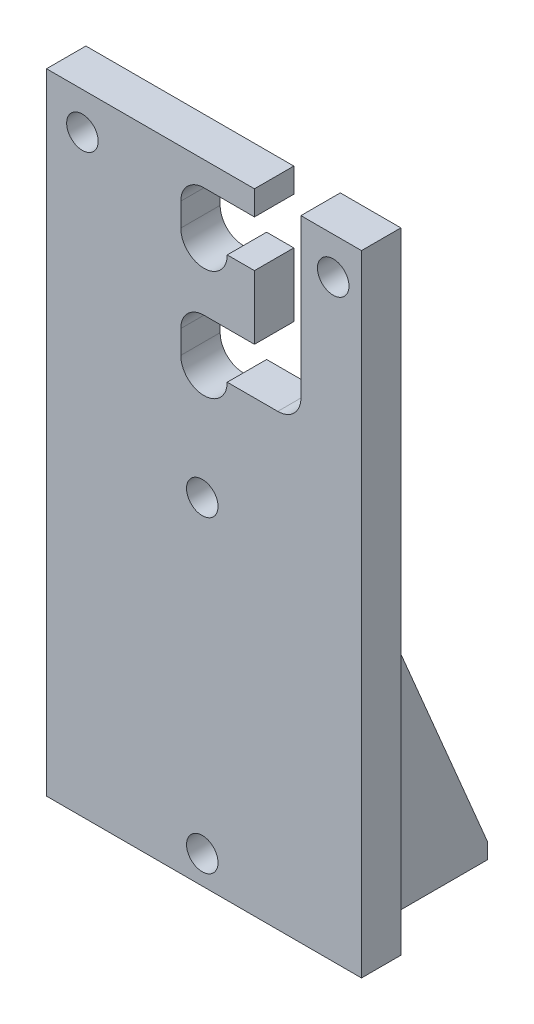
ISO-10303-21;
HEADER;
FILE_DESCRIPTION(('STEP AP214'),'2;1');
FILE_NAME('part.step','',(''),(''),'','','');
FILE_SCHEMA(('AUTOMOTIVE_DESIGN { 1 0 10303 214 1 1 1 1 }'));
ENDSEC;
DATA;
#1=APPLICATION_CONTEXT('core data for automotive mechanical design processes');
#2=APPLICATION_PROTOCOL_DEFINITION('international standard','automotive_design',2000,#1);
#3=PRODUCT_CONTEXT('',#1,'mechanical');
#4=PRODUCT('Part','Part','',(#3));
#5=PRODUCT_RELATED_PRODUCT_CATEGORY('part','',(#4));
#6=PRODUCT_DEFINITION_FORMATION('','',#4);
#7=PRODUCT_DEFINITION_CONTEXT('part definition',#1,'design');
#8=PRODUCT_DEFINITION('design','',#6,#7);
#9=PRODUCT_DEFINITION_SHAPE('','',#8);
#10=(LENGTH_UNIT() NAMED_UNIT(*) SI_UNIT(.MILLI.,.METRE.));
#11=(NAMED_UNIT(*) PLANE_ANGLE_UNIT() SI_UNIT($,.RADIAN.));
#12=(NAMED_UNIT(*) SI_UNIT($,.STERADIAN.) SOLID_ANGLE_UNIT());
#13=UNCERTAINTY_MEASURE_WITH_UNIT(LENGTH_MEASURE(1.E-05),#10,'distance_accuracy_value','');
#14=(GEOMETRIC_REPRESENTATION_CONTEXT(3) GLOBAL_UNCERTAINTY_ASSIGNED_CONTEXT((#13)) GLOBAL_UNIT_ASSIGNED_CONTEXT((#10,
#11,#12)) REPRESENTATION_CONTEXT('',''));
#15=CARTESIAN_POINT('',(0.,0.,0.));
#16=DIRECTION('',(0.,0.,1.));
#17=DIRECTION('',(1.,0.,0.));
#18=AXIS2_PLACEMENT_3D('',#15,#16,#17);
#19=CARTESIAN_POINT('',(0.,0.,2.5));
#20=DIRECTION('',(0.,0.,1.));
#21=DIRECTION('',(1.,0.,0.));
#22=AXIS2_PLACEMENT_3D('',#19,#20,#21);
#23=PLANE('',#22);
#24=CARTESIAN_POINT('',(2.27941903587919,37.6474717963443,2.5));
#25=DIRECTION('',(0.,0.,1.));
#26=DIRECTION('',(1.,0.,0.));
#27=AXIS2_PLACEMENT_3D('',#24,#25,#26);
#28=CIRCLE('',#27,1.);
#29=CARTESIAN_POINT('',(3.27941903587919,37.6474717963443,2.5));
#30=VERTEX_POINT('',#29);
#31=EDGE_CURVE('E240',#30,#30,#28,.T.);
#32=ORIENTED_EDGE('',*,*,#31,.F.);
#33=EDGE_LOOP('',(#32));
#34=FACE_BOUND('',#33,.T.);
#35=CARTESIAN_POINT('',(18.2044218174552,37.6474717963443,2.5));
#36=DIRECTION('',(0.,0.,1.));
#37=DIRECTION('',(1.,0.,0.));
#38=AXIS2_PLACEMENT_3D('',#35,#36,#37);
#39=CIRCLE('',#38,1.);
#40=CARTESIAN_POINT('',(19.2044218174552,37.6474717963443,2.5));
#41=VERTEX_POINT('',#40);
#42=EDGE_CURVE('E260',#41,#41,#39,.T.);
#43=ORIENTED_EDGE('',*,*,#42,.F.);
#44=EDGE_LOOP('',(#43));
#45=FACE_BOUND('',#44,.T.);
#46=CARTESIAN_POINT('',(9.89082515276729,1.78639023600702,2.5));
#47=DIRECTION('',(0.,0.,1.));
#48=DIRECTION('',(1.,0.,0.));
#49=AXIS2_PLACEMENT_3D('',#46,#47,#48);
#50=CIRCLE('',#49,1.);
#51=CARTESIAN_POINT('',(10.8908251527673,1.78639023600702,2.5));
#52=VERTEX_POINT('',#51);
#53=EDGE_CURVE('E257',#52,#52,#50,.T.);
#54=ORIENTED_EDGE('',*,*,#53,.F.);
#55=EDGE_LOOP('',(#54));
#56=FACE_BOUND('',#55,.T.);
#57=CARTESIAN_POINT('',(9.89082515276729,21.3671843236039,2.5));
#58=DIRECTION('',(0.,0.,1.));
#59=DIRECTION('',(1.,0.,0.));
#60=AXIS2_PLACEMENT_3D('',#57,#58,#59);
#61=CIRCLE('',#60,1.);
#62=CARTESIAN_POINT('',(10.8908251527673,21.3671843236039,2.5));
#63=VERTEX_POINT('',#62);
#64=EDGE_CURVE('E254',#63,#63,#61,.T.);
#65=ORIENTED_EDGE('',*,*,#64,.F.);
#66=EDGE_LOOP('',(#65));
#67=FACE_BOUND('',#66,.T.);
#68=CARTESIAN_POINT('',(10.,35.5,2.5));
#69=DIRECTION('',(0.,0.,-1.));
#70=DIRECTION('',(-1.,0.,0.));
#71=AXIS2_PLACEMENT_3D('',#68,#69,#70);
#72=CIRCLE('',#71,1.475);
#73=CARTESIAN_POINT('',(11.475,35.5,2.5));
#74=VERTEX_POINT('',#73);
#75=CARTESIAN_POINT('',(8.525,35.5,2.5));
#76=VERTEX_POINT('',#75);
#77=EDGE_CURVE('E226',#74,#76,#72,.T.);
#78=ORIENTED_EDGE('',*,*,#77,.T.);
#79=DIRECTION('',(0.,1.,0.));
#80=VECTOR('',#79,1.);
#81=CARTESIAN_POINT('',(8.525,35.5,2.5));
#82=LINE('',#81,#80);
#83=CARTESIAN_POINT('',(8.525,36.98,2.5));
#84=VERTEX_POINT('',#83);
#85=EDGE_CURVE('E386',#76,#84,#82,.T.);
#86=ORIENTED_EDGE('',*,*,#85,.T.);
#87=CARTESIAN_POINT('',(9.995,36.98,2.5));
#88=DIRECTION('',(0.,0.,1.));
#89=DIRECTION('',(1.,0.,0.));
#90=AXIS2_PLACEMENT_3D('',#87,#88,#89);
#91=CIRCLE('',#90,1.47);
#92=CARTESIAN_POINT('',(9.995,38.45,2.5));
#93=VERTEX_POINT('',#92);
#94=EDGE_CURVE('E346',#84,#93,#91,.F.);
#95=ORIENTED_EDGE('',*,*,#94,.T.);
#96=DIRECTION('',(1.,0.,0.));
#97=VECTOR('',#96,1.);
#98=CARTESIAN_POINT('',(9.995,38.45,2.5));
#99=LINE('',#98,#97);
#100=CARTESIAN_POINT('',(13.2029216991025,38.45,2.5));
#101=VERTEX_POINT('',#100);
#102=EDGE_CURVE('E349',#93,#101,#99,.T.);
#103=ORIENTED_EDGE('',*,*,#102,.T.);
#104=DIRECTION('',(0.,1.,0.));
#105=VECTOR('',#104,1.);
#106=CARTESIAN_POINT('',(13.2029216991025,38.45,2.5));
#107=LINE('',#106,#105);
#108=CARTESIAN_POINT('',(13.2029216991025,40.,2.5));
#109=VERTEX_POINT('',#108);
#110=EDGE_CURVE('E65',#101,#109,#107,.T.);
#111=ORIENTED_EDGE('',*,*,#110,.T.);
#112=DIRECTION('',(-1.,0.,0.));
#113=VECTOR('',#112,1.);
#114=CARTESIAN_POINT('',(12.8029216991025,40.,2.5));
#115=LINE('',#114,#113);
#116=CARTESIAN_POINT('',(0.,40.,2.5));
#117=VERTEX_POINT('',#116);
#118=EDGE_CURVE('E11',#109,#117,#115,.T.);
#119=ORIENTED_EDGE('',*,*,#118,.T.);
#120=DIRECTION('',(0.,-1.,0.));
#121=VECTOR('',#120,1.);
#122=CARTESIAN_POINT('',(0.,0.,2.5));
#123=LINE('',#122,#121);
#124=CARTESIAN_POINT('',(0.,0.,2.5));
#125=VERTEX_POINT('',#124);
#126=EDGE_CURVE('E242',#117,#125,#123,.T.);
#127=ORIENTED_EDGE('',*,*,#126,.T.);
#128=DIRECTION('',(1.,0.,0.));
#129=VECTOR('',#128,1.);
#130=CARTESIAN_POINT('',(0.,0.,2.5));
#131=LINE('',#130,#129);
#132=CARTESIAN_POINT('',(20.,0.,2.5));
#133=VERTEX_POINT('',#132);
#134=EDGE_CURVE('E239',#125,#133,#131,.T.);
#135=ORIENTED_EDGE('',*,*,#134,.T.);
#136=DIRECTION('',(0.,1.,0.));
#137=VECTOR('',#136,1.);
#138=CARTESIAN_POINT('',(20.,0.,2.5));
#139=LINE('',#138,#137);
#140=CARTESIAN_POINT('',(20.,40.,2.5));
#141=VERTEX_POINT('',#140);
#142=EDGE_CURVE('E229',#133,#141,#139,.T.);
#143=ORIENTED_EDGE('',*,*,#142,.T.);
#144=CARTESIAN_POINT('',(16.1529216991025,40.,2.5));
#145=VERTEX_POINT('',#144);
#146=EDGE_CURVE('E52',#141,#145,#115,.T.);
#147=ORIENTED_EDGE('',*,*,#146,.T.);
#148=DIRECTION('',(0.,1.,0.));
#149=VECTOR('',#148,1.);
#150=CARTESIAN_POINT('',(16.1529216991025,29.97,2.5));
#151=LINE('',#150,#149);
#152=CARTESIAN_POINT('',(16.1529216991025,29.97,2.5));
#153=VERTEX_POINT('',#152);
#154=EDGE_CURVE('E388',#153,#145,#151,.T.);
#155=ORIENTED_EDGE('',*,*,#154,.F.);
#156=CARTESIAN_POINT('',(14.6829216991025,29.97,2.5));
#157=DIRECTION('',(0.,0.,1.));
#158=DIRECTION('',(1.,0.,0.));
#159=AXIS2_PLACEMENT_3D('',#156,#157,#158);
#160=CIRCLE('',#159,1.47);
#161=CARTESIAN_POINT('',(14.6829216991025,28.5,2.5));
#162=VERTEX_POINT('',#161);
#163=EDGE_CURVE('E390',#162,#153,#160,.T.);
#164=ORIENTED_EDGE('',*,*,#163,.F.);
#165=DIRECTION('',(1.,0.,0.));
#166=VECTOR('',#165,1.);
#167=CARTESIAN_POINT('',(11.475,28.5,2.5));
#168=LINE('',#167,#166);
#169=CARTESIAN_POINT('',(11.475,28.5,2.5));
#170=VERTEX_POINT('',#169);
#171=EDGE_CURVE('E394',#170,#162,#168,.T.);
#172=ORIENTED_EDGE('',*,*,#171,.F.);
#173=CARTESIAN_POINT('',(10.,28.5,2.5));
#174=DIRECTION('',(0.,0.,-1.));
#175=DIRECTION('',(-1.,0.,0.));
#176=AXIS2_PLACEMENT_3D('',#173,#174,#175);
#177=CIRCLE('',#176,1.475);
#178=CARTESIAN_POINT('',(8.52499999999949,28.5,2.5));
#179=VERTEX_POINT('',#178);
#180=EDGE_CURVE('E406',#170,#179,#177,.T.);
#181=ORIENTED_EDGE('',*,*,#180,.T.);
#182=DIRECTION('',(3.46944695195255E-13,1.,0.));
#183=VECTOR('',#182,1.);
#184=CARTESIAN_POINT('',(8.525,29.97,2.5));
#185=LINE('',#184,#183);
#186=CARTESIAN_POINT('',(8.525,29.975,2.5));
#187=VERTEX_POINT('',#186);
#188=EDGE_CURVE('E368',#179,#187,#185,.T.);
#189=ORIENTED_EDGE('',*,*,#188,.T.);
#190=CARTESIAN_POINT('',(9.995,29.975,2.5));
#191=DIRECTION('',(0.,0.,1.));
#192=DIRECTION('',(1.,0.,0.));
#193=AXIS2_PLACEMENT_3D('',#190,#191,#192);
#194=CIRCLE('',#193,1.47);
#195=CARTESIAN_POINT('',(9.995,31.445,2.5));
#196=VERTEX_POINT('',#195);
#197=EDGE_CURVE('E369',#187,#196,#194,.F.);
#198=ORIENTED_EDGE('',*,*,#197,.T.);
#199=DIRECTION('',(1.,0.,0.));
#200=VECTOR('',#199,1.);
#201=CARTESIAN_POINT('',(9.995,31.445,2.5));
#202=LINE('',#201,#200);
#203=CARTESIAN_POINT('',(13.2029216991025,31.445,2.5));
#204=VERTEX_POINT('',#203);
#205=EDGE_CURVE('E372',#196,#204,#202,.T.);
#206=ORIENTED_EDGE('',*,*,#205,.T.);
#207=DIRECTION('',(0.,-1.,0.));
#208=VECTOR('',#207,1.);
#209=CARTESIAN_POINT('',(13.2029216991025,35.5,2.5));
#210=LINE('',#209,#208);
#211=CARTESIAN_POINT('',(13.2029216991025,35.5,2.5));
#212=VERTEX_POINT('',#211);
#213=EDGE_CURVE('E397',#212,#204,#210,.T.);
#214=ORIENTED_EDGE('',*,*,#213,.F.);
#215=DIRECTION('',(1.,0.,0.));
#216=VECTOR('',#215,1.);
#217=CARTESIAN_POINT('',(11.475,35.5,2.5));
#218=LINE('',#217,#216);
#219=EDGE_CURVE('E403',#74,#212,#218,.T.);
#220=ORIENTED_EDGE('',*,*,#219,.F.);
#221=EDGE_LOOP('',(#78,#86,#95,#103,#111,#119,#127,#135,#143,#147,#155,#164,#172,#181,#189,#198,
#206,#214,#220));
#222=FACE_BOUND('',#221,.T.);
#223=ADVANCED_FACE('F43',(#34,#45,#56,#67,#222),#23,.T.);
#224=CARTESIAN_POINT('',(5.,1.,-8.));
#225=DIRECTION('',(0.,0.388057000058133,-0.921635375138065));
#226=DIRECTION('',(0.,0.921635375138065,0.388057000058133));
#227=AXIS2_PLACEMENT_3D('',#224,#225,#226);
#228=PLANE('',#227);
#229=DIRECTION('',(0.,0.921635375138065,0.388057000058133));
#230=VECTOR('',#229,1.);
#231=CARTESIAN_POINT('',(2.5,1.,-8.));
#232=LINE('',#231,#230);
#233=CARTESIAN_POINT('',(2.5,1.,-8.));
#234=VERTEX_POINT('',#233);
#235=CARTESIAN_POINT('',(2.5,20.,0.));
#236=VERTEX_POINT('',#235);
#237=EDGE_CURVE('E308',#234,#236,#232,.T.);
#238=ORIENTED_EDGE('',*,*,#237,.T.);
#239=DIRECTION('',(1.,0.,0.));
#240=VECTOR('',#239,1.);
#241=CARTESIAN_POINT('',(0.,20.,0.));
#242=LINE('',#241,#240);
#243=CARTESIAN_POINT('',(7.5,20.,0.));
#244=VERTEX_POINT('',#243);
#245=EDGE_CURVE('E302',#236,#244,#242,.T.);
#246=ORIENTED_EDGE('',*,*,#245,.T.);
#247=DIRECTION('',(0.,0.921635375138065,0.388057000058133));
#248=VECTOR('',#247,1.);
#249=CARTESIAN_POINT('',(7.5,1.,-8.));
#250=LINE('',#249,#248);
#251=CARTESIAN_POINT('',(7.5,1.,-8.));
#252=VERTEX_POINT('',#251);
#253=EDGE_CURVE('E307',#252,#244,#250,.T.);
#254=ORIENTED_EDGE('',*,*,#253,.F.);
#255=DIRECTION('',(1.,0.,0.));
#256=VECTOR('',#255,1.);
#257=CARTESIAN_POINT('',(2.5,1.,-8.));
#258=LINE('',#257,#256);
#259=EDGE_CURVE('E286',#234,#252,#258,.T.);
#260=ORIENTED_EDGE('',*,*,#259,.F.);
#261=EDGE_LOOP('',(#238,#246,#254,#260));
#262=FACE_BOUND('',#261,.T.);
#263=ADVANCED_FACE('F534',(#262),#228,.T.);
#264=CARTESIAN_POINT('',(15.,1.,-8.));
#265=DIRECTION('',(0.,-0.388057000058133,0.921635375138065));
#266=DIRECTION('',(0.,0.921635375138065,0.388057000058133));
#267=AXIS2_PLACEMENT_3D('',#264,#265,#266);
#268=PLANE('',#267);
#269=DIRECTION('',(0.,0.921635375138065,0.388057000058133));
#270=VECTOR('',#269,1.);
#271=CARTESIAN_POINT('',(12.5,1.,-8.));
#272=LINE('',#271,#270);
#273=CARTESIAN_POINT('',(12.5,1.,-8.));
#274=VERTEX_POINT('',#273);
#275=CARTESIAN_POINT('',(12.5,20.,0.));
#276=VERTEX_POINT('',#275);
#277=EDGE_CURVE('E338',#274,#276,#272,.T.);
#278=ORIENTED_EDGE('',*,*,#277,.T.);
#279=DIRECTION('',(-1.,0.,0.));
#280=VECTOR('',#279,1.);
#281=CARTESIAN_POINT('',(0.,20.,0.));
#282=LINE('',#281,#280);
#283=CARTESIAN_POINT('',(17.5,20.,0.));
#284=VERTEX_POINT('',#283);
#285=EDGE_CURVE('E333',#276,#284,#282,.F.);
#286=ORIENTED_EDGE('',*,*,#285,.T.);
#287=DIRECTION('',(0.,0.921635375138065,0.388057000058133));
#288=VECTOR('',#287,1.);
#289=CARTESIAN_POINT('',(17.5,1.,-8.));
#290=LINE('',#289,#288);
#291=CARTESIAN_POINT('',(17.5,1.,-8.));
#292=VERTEX_POINT('',#291);
#293=EDGE_CURVE('E339',#292,#284,#290,.T.);
#294=ORIENTED_EDGE('',*,*,#293,.F.);
#295=DIRECTION('',(-1.,0.,0.));
#296=VECTOR('',#295,1.);
#297=CARTESIAN_POINT('',(17.5,1.,-8.));
#298=LINE('',#297,#296);
#299=EDGE_CURVE('E317',#292,#274,#298,.T.);
#300=ORIENTED_EDGE('',*,*,#299,.T.);
#301=EDGE_LOOP('',(#278,#286,#294,#300));
#302=FACE_BOUND('',#301,.T.);
#303=ADVANCED_FACE('F536',(#302),#268,.F.);
#304=CARTESIAN_POINT('',(8.525,35.5,17.551106751586));
#305=DIRECTION('',(-1.,0.,0.));
#306=DIRECTION('',(0.,0.,1.));
#307=AXIS2_PLACEMENT_3D('',#304,#305,#306);
#308=PLANE('',#307);
#309=DIRECTION('',(0.,0.,-1.));
#310=VECTOR('',#309,1.);
#311=CARTESIAN_POINT('',(8.525,35.5,17.551106751586));
#312=LINE('',#311,#310);
#313=CARTESIAN_POINT('',(8.525,35.5,0.));
#314=VERTEX_POINT('',#313);
#315=EDGE_CURVE('E381',#76,#314,#312,.T.);
#316=ORIENTED_EDGE('',*,*,#315,.T.);
#317=DIRECTION('',(0.,1.,0.));
#318=VECTOR('',#317,1.);
#319=CARTESIAN_POINT('',(8.525,35.5,0.));
#320=LINE('',#319,#318);
#321=CARTESIAN_POINT('',(8.525,36.98,0.));
#322=VERTEX_POINT('',#321);
#323=EDGE_CURVE('E410',#314,#322,#320,.T.);
#324=ORIENTED_EDGE('',*,*,#323,.T.);
#325=DIRECTION('',(0.,0.,-1.));
#326=VECTOR('',#325,1.);
#327=CARTESIAN_POINT('',(8.525,36.98,17.551106751586));
#328=LINE('',#327,#326);
#329=EDGE_CURVE('E384',#84,#322,#328,.T.);
#330=ORIENTED_EDGE('',*,*,#329,.F.);
#331=ORIENTED_EDGE('',*,*,#85,.F.);
#332=EDGE_LOOP('',(#316,#324,#330,#331));
#333=FACE_BOUND('',#332,.T.);
#334=ADVANCED_FACE('F479',(#333),#308,.F.);
#335=CARTESIAN_POINT('',(9.995,36.98,17.551106751586));
#336=DIRECTION('',(0.,0.,-1.));
#337=DIRECTION('',(-1.,0.,0.));
#338=AXIS2_PLACEMENT_3D('',#335,#336,#337);
#339=CYLINDRICAL_SURFACE('',#338,1.47);
#340=ORIENTED_EDGE('',*,*,#329,.T.);
#341=CARTESIAN_POINT('',(9.995,36.98,0.));
#342=DIRECTION('',(0.,0.,-1.));
#343=DIRECTION('',(-1.,0.,0.));
#344=AXIS2_PLACEMENT_3D('',#341,#342,#343);
#345=CIRCLE('',#344,1.47);
#346=CARTESIAN_POINT('',(9.995,38.45,0.));
#347=VERTEX_POINT('',#346);
#348=EDGE_CURVE('E391',#322,#347,#345,.T.);
#349=ORIENTED_EDGE('',*,*,#348,.T.);
#350=DIRECTION('',(0.,0.,-1.));
#351=VECTOR('',#350,1.);
#352=CARTESIAN_POINT('',(9.995,38.45,17.551106751586));
#353=LINE('',#352,#351);
#354=EDGE_CURVE('E342',#93,#347,#353,.T.);
#355=ORIENTED_EDGE('',*,*,#354,.F.);
#356=ORIENTED_EDGE('',*,*,#94,.F.);
#357=EDGE_LOOP('',(#340,#349,#355,#356));
#358=FACE_BOUND('',#357,.T.);
#359=ADVANCED_FACE('F474',(#358),#339,.F.);
#360=CARTESIAN_POINT('',(9.995,38.45,17.551106751586));
#361=DIRECTION('',(0.,1.,0.));
#362=DIRECTION('',(0.,0.,1.));
#363=AXIS2_PLACEMENT_3D('',#360,#361,#362);
#364=PLANE('',#363);
#365=ORIENTED_EDGE('',*,*,#354,.T.);
#366=DIRECTION('',(1.,0.,0.));
#367=VECTOR('',#366,1.);
#368=CARTESIAN_POINT('',(9.995,38.45,0.));
#369=LINE('',#368,#367);
#370=CARTESIAN_POINT('',(13.2029216991025,38.45,0.));
#371=VERTEX_POINT('',#370);
#372=EDGE_CURVE('E413',#347,#371,#369,.T.);
#373=ORIENTED_EDGE('',*,*,#372,.T.);
#374=DIRECTION('',(0.,0.,-1.));
#375=VECTOR('',#374,1.);
#376=CARTESIAN_POINT('',(13.2029216991025,38.45,17.551106751586));
#377=LINE('',#376,#375);
#378=EDGE_CURVE('E347',#101,#371,#377,.T.);
#379=ORIENTED_EDGE('',*,*,#378,.F.);
#380=ORIENTED_EDGE('',*,*,#102,.F.);
#381=EDGE_LOOP('',(#365,#373,#379,#380));
#382=FACE_BOUND('',#381,.T.);
#383=ADVANCED_FACE('F470',(#382),#364,.F.);
#384=CARTESIAN_POINT('',(13.2029216991025,38.45,17.551106751586));
#385=DIRECTION('',(-1.,0.,0.));
#386=DIRECTION('',(0.,-1.,0.));
#387=AXIS2_PLACEMENT_3D('',#384,#385,#386);
#388=PLANE('',#387);
#389=ORIENTED_EDGE('',*,*,#378,.T.);
#390=DIRECTION('',(0.,1.,0.));
#391=VECTOR('',#390,1.);
#392=CARTESIAN_POINT('',(13.2029216991025,38.45,0.));
#393=LINE('',#392,#391);
#394=CARTESIAN_POINT('',(13.2029216991025,40.,0.));
#395=VERTEX_POINT('',#394);
#396=EDGE_CURVE('E416',#371,#395,#393,.T.);
#397=ORIENTED_EDGE('',*,*,#396,.T.);
#398=DIRECTION('',(0.,0.,-1.));
#399=VECTOR('',#398,1.);
#400=CARTESIAN_POINT('',(13.2029216991025,40.,17.551106751586));
#401=LINE('',#400,#399);
#402=EDGE_CURVE('E350',#109,#395,#401,.T.);
#403=ORIENTED_EDGE('',*,*,#402,.F.);
#404=ORIENTED_EDGE('',*,*,#110,.F.);
#405=EDGE_LOOP('',(#389,#397,#403,#404));
#406=FACE_BOUND('',#405,.T.);
#407=ADVANCED_FACE('F466',(#406),#388,.F.);
#408=CARTESIAN_POINT('',(0.,40.,6.));
#409=DIRECTION('',(0.,-1.,0.));
#410=DIRECTION('',(0.,0.,-1.));
#411=AXIS2_PLACEMENT_3D('',#408,#409,#410);
#412=PLANE('',#411);
#413=DIRECTION('',(0.,0.,-1.));
#414=VECTOR('',#413,1.);
#415=CARTESIAN_POINT('',(0.,40.,6.));
#416=LINE('',#415,#414);
#417=CARTESIAN_POINT('',(0.,40.,0.));
#418=VERTEX_POINT('',#417);
#419=EDGE_CURVE('E233',#117,#418,#416,.T.);
#420=ORIENTED_EDGE('',*,*,#419,.F.);
#421=ORIENTED_EDGE('',*,*,#118,.F.);
#422=ORIENTED_EDGE('',*,*,#402,.T.);
#423=DIRECTION('',(-1.,0.,0.));
#424=VECTOR('',#423,1.);
#425=CARTESIAN_POINT('',(0.,40.,0.));
#426=LINE('',#425,#424);
#427=EDGE_CURVE('E273',#395,#418,#426,.T.);
#428=ORIENTED_EDGE('',*,*,#427,.T.);
#429=EDGE_LOOP('',(#420,#421,#422,#428));
#430=FACE_BOUND('',#429,.T.);
#431=ADVANCED_FACE('F461',(#430),#412,.F.);
#432=CARTESIAN_POINT('',(17.5,1.,0.));
#433=DIRECTION('',(-1.,0.,0.));
#434=DIRECTION('',(0.,0.,1.));
#435=AXIS2_PLACEMENT_3D('',#432,#433,#434);
#436=PLANE('',#435);
#437=DIRECTION('',(0.,0.,-1.));
#438=VECTOR('',#437,1.);
#439=CARTESIAN_POINT('',(17.5,0.,0.));
#440=LINE('',#439,#438);
#441=CARTESIAN_POINT('',(17.5,0.,0.));
#442=VERTEX_POINT('',#441);
#443=CARTESIAN_POINT('',(17.5,0.,-8.));
#444=VERTEX_POINT('',#443);
#445=EDGE_CURVE('E330',#442,#444,#440,.T.);
#446=ORIENTED_EDGE('',*,*,#445,.T.);
#447=DIRECTION('',(0.,-1.,0.));
#448=VECTOR('',#447,1.);
#449=CARTESIAN_POINT('',(17.5,1.,-8.));
#450=LINE('',#449,#448);
#451=EDGE_CURVE('E311',#292,#444,#450,.T.);
#452=ORIENTED_EDGE('',*,*,#451,.F.);
#453=ORIENTED_EDGE('',*,*,#293,.T.);
#454=DIRECTION('',(0.,-1.,0.));
#455=VECTOR('',#454,1.);
#456=CARTESIAN_POINT('',(17.5,1.,0.));
#457=LINE('',#456,#455);
#458=EDGE_CURVE('E314',#284,#442,#457,.T.);
#459=ORIENTED_EDGE('',*,*,#458,.T.);
#460=EDGE_LOOP('',(#446,#452,#453,#459));
#461=FACE_BOUND('',#460,.T.);
#462=ADVANCED_FACE('F554',(#461),#436,.F.);
#463=CARTESIAN_POINT('',(17.5,1.,-8.));
#464=DIRECTION('',(0.,0.,1.));
#465=DIRECTION('',(1.,0.,0.));
#466=AXIS2_PLACEMENT_3D('',#463,#464,#465);
#467=PLANE('',#466);
#468=DIRECTION('',(-1.,0.,0.));
#469=VECTOR('',#468,1.);
#470=CARTESIAN_POINT('',(17.5,0.,-8.));
#471=LINE('',#470,#469);
#472=CARTESIAN_POINT('',(12.5,0.,-8.));
#473=VERTEX_POINT('',#472);
#474=EDGE_CURVE('E326',#444,#473,#471,.T.);
#475=ORIENTED_EDGE('',*,*,#474,.T.);
#476=DIRECTION('',(0.,-1.,0.));
#477=VECTOR('',#476,1.);
#478=CARTESIAN_POINT('',(12.5,1.,-8.));
#479=LINE('',#478,#477);
#480=EDGE_CURVE('E321',#274,#473,#479,.T.);
#481=ORIENTED_EDGE('',*,*,#480,.F.);
#482=ORIENTED_EDGE('',*,*,#299,.F.);
#483=ORIENTED_EDGE('',*,*,#451,.T.);
#484=EDGE_LOOP('',(#475,#481,#482,#483));
#485=FACE_BOUND('',#484,.T.);
#486=ADVANCED_FACE('F557',(#485),#467,.F.);
#487=CARTESIAN_POINT('',(12.5,1.,0.));
#488=DIRECTION('',(1.,0.,0.));
#489=DIRECTION('',(0.,0.,-1.));
#490=AXIS2_PLACEMENT_3D('',#487,#488,#489);
#491=PLANE('',#490);
#492=DIRECTION('',(0.,-1.,0.));
#493=VECTOR('',#492,1.);
#494=CARTESIAN_POINT('',(12.5,1.,0.));
#495=LINE('',#494,#493);
#496=CARTESIAN_POINT('',(12.5,0.,0.));
#497=VERTEX_POINT('',#496);
#498=EDGE_CURVE('E318',#276,#497,#495,.T.);
#499=ORIENTED_EDGE('',*,*,#498,.F.);
#500=ORIENTED_EDGE('',*,*,#277,.F.);
#501=ORIENTED_EDGE('',*,*,#480,.T.);
#502=DIRECTION('',(0.,0.,1.));
#503=VECTOR('',#502,1.);
#504=CARTESIAN_POINT('',(12.5,0.,0.));
#505=LINE('',#504,#503);
#506=EDGE_CURVE('E328',#473,#497,#505,.T.);
#507=ORIENTED_EDGE('',*,*,#506,.T.);
#508=EDGE_LOOP('',(#499,#500,#501,#507));
#509=FACE_BOUND('',#508,.T.);
#510=ADVANCED_FACE('F559',(#509),#491,.F.);
#511=CARTESIAN_POINT('',(7.5,1.,0.));
#512=DIRECTION('',(1.,0.,0.));
#513=DIRECTION('',(0.,0.,-1.));
#514=AXIS2_PLACEMENT_3D('',#511,#512,#513);
#515=PLANE('',#514);
#516=ORIENTED_EDGE('',*,*,#253,.T.);
#517=DIRECTION('',(0.,-1.,0.));
#518=VECTOR('',#517,1.);
#519=CARTESIAN_POINT('',(7.5,1.,0.));
#520=LINE('',#519,#518);
#521=CARTESIAN_POINT('',(7.5,0.,0.));
#522=VERTEX_POINT('',#521);
#523=EDGE_CURVE('E289',#244,#522,#520,.T.);
#524=ORIENTED_EDGE('',*,*,#523,.T.);
#525=DIRECTION('',(0.,0.,1.));
#526=VECTOR('',#525,1.);
#527=CARTESIAN_POINT('',(7.5,0.,0.));
#528=LINE('',#527,#526);
#529=CARTESIAN_POINT('',(7.5,0.,-8.));
#530=VERTEX_POINT('',#529);
#531=EDGE_CURVE('E293',#530,#522,#528,.T.);
#532=ORIENTED_EDGE('',*,*,#531,.F.);
#533=DIRECTION('',(0.,-1.,0.));
#534=VECTOR('',#533,1.);
#535=CARTESIAN_POINT('',(7.5,1.,-8.));
#536=LINE('',#535,#534);
#537=EDGE_CURVE('E287',#252,#530,#536,.T.);
#538=ORIENTED_EDGE('',*,*,#537,.F.);
#539=EDGE_LOOP('',(#516,#524,#532,#538));
#540=FACE_BOUND('',#539,.T.);
#541=ADVANCED_FACE('F552',(#540),#515,.T.);
#542=CARTESIAN_POINT('',(2.5,1.,-8.));
#543=DIRECTION('',(0.,0.,-1.));
#544=DIRECTION('',(-1.,0.,0.));
#545=AXIS2_PLACEMENT_3D('',#542,#543,#544);
#546=PLANE('',#545);
#547=DIRECTION('',(1.,0.,0.));
#548=VECTOR('',#547,1.);
#549=CARTESIAN_POINT('',(2.5,0.,-8.));
#550=LINE('',#549,#548);
#551=CARTESIAN_POINT('',(2.5,0.,-8.));
#552=VERTEX_POINT('',#551);
#553=EDGE_CURVE('E296',#552,#530,#550,.T.);
#554=ORIENTED_EDGE('',*,*,#553,.F.);
#555=DIRECTION('',(0.,-1.,0.));
#556=VECTOR('',#555,1.);
#557=CARTESIAN_POINT('',(2.5,1.,-8.));
#558=LINE('',#557,#556);
#559=EDGE_CURVE('E284',#234,#552,#558,.T.);
#560=ORIENTED_EDGE('',*,*,#559,.F.);
#561=ORIENTED_EDGE('',*,*,#259,.T.);
#562=ORIENTED_EDGE('',*,*,#537,.T.);
#563=EDGE_LOOP('',(#554,#560,#561,#562));
#564=FACE_BOUND('',#563,.T.);
#565=ADVANCED_FACE('F583',(#564),#546,.T.);
#566=CARTESIAN_POINT('',(2.5,1.,0.));
#567=DIRECTION('',(-1.,0.,0.));
#568=DIRECTION('',(0.,0.,1.));
#569=AXIS2_PLACEMENT_3D('',#566,#567,#568);
#570=PLANE('',#569);
#571=DIRECTION('',(0.,0.,-1.));
#572=VECTOR('',#571,1.);
#573=CARTESIAN_POINT('',(2.5,0.,0.));
#574=LINE('',#573,#572);
#575=CARTESIAN_POINT('',(2.5,0.,0.));
#576=VERTEX_POINT('',#575);
#577=EDGE_CURVE('E299',#576,#552,#574,.T.);
#578=ORIENTED_EDGE('',*,*,#577,.F.);
#579=DIRECTION('',(0.,-1.,0.));
#580=VECTOR('',#579,1.);
#581=CARTESIAN_POINT('',(2.5,1.,0.));
#582=LINE('',#581,#580);
#583=EDGE_CURVE('E283',#236,#576,#582,.T.);
#584=ORIENTED_EDGE('',*,*,#583,.F.);
#585=ORIENTED_EDGE('',*,*,#237,.F.);
#586=ORIENTED_EDGE('',*,*,#559,.T.);
#587=EDGE_LOOP('',(#578,#584,#585,#586));
#588=FACE_BOUND('',#587,.T.);
#589=ADVANCED_FACE('F579',(#588),#570,.T.);
#590=CARTESIAN_POINT('',(0.,0.,6.));
#591=DIRECTION('',(1.,0.,0.));
#592=DIRECTION('',(0.,0.,-1.));
#593=AXIS2_PLACEMENT_3D('',#590,#591,#592);
#594=PLANE('',#593);
#595=ORIENTED_EDGE('',*,*,#126,.F.);
#596=ORIENTED_EDGE('',*,*,#419,.T.);
#597=DIRECTION('',(0.,-1.,0.));
#598=VECTOR('',#597,1.);
#599=CARTESIAN_POINT('',(0.,0.,0.));
#600=LINE('',#599,#598);
#601=CARTESIAN_POINT('',(0.,0.,0.));
#602=VERTEX_POINT('',#601);
#603=EDGE_CURVE('E280',#418,#602,#600,.T.);
#604=ORIENTED_EDGE('',*,*,#603,.T.);
#605=DIRECTION('',(0.,0.,-1.));
#606=VECTOR('',#605,1.);
#607=CARTESIAN_POINT('',(0.,0.,6.));
#608=LINE('',#607,#606);
#609=EDGE_CURVE('E247',#125,#602,#608,.T.);
#610=ORIENTED_EDGE('',*,*,#609,.F.);
#611=EDGE_LOOP('',(#595,#596,#604,#610));
#612=FACE_BOUND('',#611,.T.);
#613=ADVANCED_FACE('F457',(#612),#594,.F.);
#614=CARTESIAN_POINT('',(0.,0.,6.));
#615=DIRECTION('',(0.,1.,0.));
#616=DIRECTION('',(0.,0.,1.));
#617=AXIS2_PLACEMENT_3D('',#614,#615,#616);
#618=PLANE('',#617);
#619=ORIENTED_EDGE('',*,*,#134,.F.);
#620=ORIENTED_EDGE('',*,*,#609,.T.);
#621=DIRECTION('',(1.,0.,0.));
#622=VECTOR('',#621,1.);
#623=CARTESIAN_POINT('',(0.,0.,0.));
#624=LINE('',#623,#622);
#625=EDGE_CURVE('E275',#602,#576,#624,.T.);
#626=ORIENTED_EDGE('',*,*,#625,.T.);
#627=ORIENTED_EDGE('',*,*,#577,.T.);
#628=ORIENTED_EDGE('',*,*,#553,.T.);
#629=ORIENTED_EDGE('',*,*,#531,.T.);
#630=EDGE_CURVE('E278',#522,#497,#624,.T.);
#631=ORIENTED_EDGE('',*,*,#630,.T.);
#632=ORIENTED_EDGE('',*,*,#506,.F.);
#633=ORIENTED_EDGE('',*,*,#474,.F.);
#634=ORIENTED_EDGE('',*,*,#445,.F.);
#635=CARTESIAN_POINT('',(20.,0.,0.));
#636=VERTEX_POINT('',#635);
#637=EDGE_CURVE('E279',#442,#636,#624,.T.);
#638=ORIENTED_EDGE('',*,*,#637,.T.);
#639=DIRECTION('',(0.,0.,-1.));
#640=VECTOR('',#639,1.);
#641=CARTESIAN_POINT('',(20.,0.,6.));
#642=LINE('',#641,#640);
#643=EDGE_CURVE('E234',#133,#636,#642,.T.);
#644=ORIENTED_EDGE('',*,*,#643,.F.);
#645=EDGE_LOOP('',(#619,#620,#626,#627,#628,#629,#631,#632,#633,#634,#638,#644));
#646=FACE_BOUND('',#645,.T.);
#647=ADVANCED_FACE('F448',(#646),#618,.F.);
#648=CARTESIAN_POINT('',(20.,0.,6.));
#649=DIRECTION('',(-1.,0.,0.));
#650=DIRECTION('',(0.,0.,1.));
#651=AXIS2_PLACEMENT_3D('',#648,#649,#650);
#652=PLANE('',#651);
#653=ORIENTED_EDGE('',*,*,#142,.F.);
#654=ORIENTED_EDGE('',*,*,#643,.T.);
#655=DIRECTION('',(0.,1.,0.));
#656=VECTOR('',#655,1.);
#657=CARTESIAN_POINT('',(20.,0.,0.));
#658=LINE('',#657,#656);
#659=CARTESIAN_POINT('',(20.,40.,0.));
#660=VERTEX_POINT('',#659);
#661=EDGE_CURVE('E231',#636,#660,#658,.T.);
#662=ORIENTED_EDGE('',*,*,#661,.T.);
#663=DIRECTION('',(0.,0.,-1.));
#664=VECTOR('',#663,1.);
#665=CARTESIAN_POINT('',(20.,40.,6.));
#666=LINE('',#665,#664);
#667=EDGE_CURVE('E223',#141,#660,#666,.T.);
#668=ORIENTED_EDGE('',*,*,#667,.F.);
#669=EDGE_LOOP('',(#653,#654,#662,#668));
#670=FACE_BOUND('',#669,.T.);
#671=ADVANCED_FACE('F45',(#670),#652,.F.);
#672=ORIENTED_EDGE('',*,*,#146,.F.);
#673=ORIENTED_EDGE('',*,*,#667,.T.);
#674=CARTESIAN_POINT('',(16.1529216991025,40.,0.));
#675=VERTEX_POINT('',#674);
#676=EDGE_CURVE('E271',#660,#675,#426,.T.);
#677=ORIENTED_EDGE('',*,*,#676,.T.);
#678=DIRECTION('',(0.,0.,-1.));
#679=VECTOR('',#678,1.);
#680=CARTESIAN_POINT('',(16.1529216991025,40.,17.551106751586));
#681=LINE('',#680,#679);
#682=EDGE_CURVE('E225',#145,#675,#681,.T.);
#683=ORIENTED_EDGE('',*,*,#682,.F.);
#684=EDGE_LOOP('',(#672,#673,#677,#683));
#685=FACE_BOUND('',#684,.T.);
#686=ADVANCED_FACE('F221',(#685),#412,.F.);
#687=CARTESIAN_POINT('',(16.1529216991025,29.97,17.551106751586));
#688=DIRECTION('',(-1.,0.,0.));
#689=DIRECTION('',(0.,0.,1.));
#690=AXIS2_PLACEMENT_3D('',#687,#688,#689);
#691=PLANE('',#690);
#692=ORIENTED_EDGE('',*,*,#154,.T.);
#693=ORIENTED_EDGE('',*,*,#682,.T.);
#694=DIRECTION('',(0.,1.,0.));
#695=VECTOR('',#694,1.);
#696=CARTESIAN_POINT('',(16.1529216991025,29.97,0.));
#697=LINE('',#696,#695);
#698=CARTESIAN_POINT('',(16.1529216991025,29.97,0.));
#699=VERTEX_POINT('',#698);
#700=EDGE_CURVE('E356',#699,#675,#697,.T.);
#701=ORIENTED_EDGE('',*,*,#700,.F.);
#702=DIRECTION('',(0.,0.,-1.));
#703=VECTOR('',#702,1.);
#704=CARTESIAN_POINT('',(16.1529216991025,29.97,17.551106751586));
#705=LINE('',#704,#703);
#706=EDGE_CURVE('E354',#153,#699,#705,.T.);
#707=ORIENTED_EDGE('',*,*,#706,.F.);
#708=EDGE_LOOP('',(#692,#693,#701,#707));
#709=FACE_BOUND('',#708,.T.);
#710=ADVANCED_FACE('F524',(#709),#691,.T.);
#711=CARTESIAN_POINT('',(14.6829216991025,29.97,17.551106751586));
#712=DIRECTION('',(0.,0.,-1.));
#713=DIRECTION('',(-1.,0.,0.));
#714=AXIS2_PLACEMENT_3D('',#711,#712,#713);
#715=CYLINDRICAL_SURFACE('',#714,1.47);
#716=ORIENTED_EDGE('',*,*,#163,.T.);
#717=ORIENTED_EDGE('',*,*,#706,.T.);
#718=CARTESIAN_POINT('',(14.6829216991025,29.97,0.));
#719=DIRECTION('',(0.,0.,1.));
#720=DIRECTION('',(1.,0.,0.));
#721=AXIS2_PLACEMENT_3D('',#718,#719,#720);
#722=CIRCLE('',#721,1.47);
#723=CARTESIAN_POINT('',(14.6829216991025,28.5,0.));
#724=VERTEX_POINT('',#723);
#725=EDGE_CURVE('E359',#724,#699,#722,.T.);
#726=ORIENTED_EDGE('',*,*,#725,.F.);
#727=DIRECTION('',(0.,0.,-1.));
#728=VECTOR('',#727,1.);
#729=CARTESIAN_POINT('',(14.6829216991025,28.5,17.551106751586));
#730=LINE('',#729,#728);
#731=EDGE_CURVE('E357',#162,#724,#730,.T.);
#732=ORIENTED_EDGE('',*,*,#731,.F.);
#733=EDGE_LOOP('',(#716,#717,#726,#732));
#734=FACE_BOUND('',#733,.T.);
#735=ADVANCED_FACE('F521',(#734),#715,.F.);
#736=CARTESIAN_POINT('',(11.475,28.5,17.551106751586));
#737=DIRECTION('',(0.,1.,0.));
#738=DIRECTION('',(0.,0.,1.));
#739=AXIS2_PLACEMENT_3D('',#736,#737,#738);
#740=PLANE('',#739);
#741=ORIENTED_EDGE('',*,*,#171,.T.);
#742=ORIENTED_EDGE('',*,*,#731,.T.);
#743=DIRECTION('',(1.,0.,0.));
#744=VECTOR('',#743,1.);
#745=CARTESIAN_POINT('',(11.475,28.5,0.));
#746=LINE('',#745,#744);
#747=CARTESIAN_POINT('',(11.475,28.5,0.));
#748=VERTEX_POINT('',#747);
#749=EDGE_CURVE('E362',#748,#724,#746,.T.);
#750=ORIENTED_EDGE('',*,*,#749,.F.);
#751=DIRECTION('',(0.,0.,-1.));
#752=VECTOR('',#751,1.);
#753=CARTESIAN_POINT('',(11.475,28.5,17.551106751586));
#754=LINE('',#753,#752);
#755=EDGE_CURVE('E360',#170,#748,#754,.T.);
#756=ORIENTED_EDGE('',*,*,#755,.F.);
#757=EDGE_LOOP('',(#741,#742,#750,#756));
#758=FACE_BOUND('',#757,.T.);
#759=ADVANCED_FACE('F516',(#758),#740,.T.);
#760=CARTESIAN_POINT('',(10.,28.5,17.551106751586));
#761=DIRECTION('',(0.,0.,-1.));
#762=DIRECTION('',(-1.,0.,0.));
#763=AXIS2_PLACEMENT_3D('',#760,#761,#762);
#764=CYLINDRICAL_SURFACE('',#763,1.475);
#765=DIRECTION('',(0.,0.,-1.));
#766=VECTOR('',#765,1.);
#767=CARTESIAN_POINT('',(8.525,28.5,17.551106751586));
#768=LINE('',#767,#766);
#769=CARTESIAN_POINT('',(8.525,28.5,0.));
#770=VERTEX_POINT('',#769);
#771=EDGE_CURVE('E363',#179,#770,#768,.T.);
#772=ORIENTED_EDGE('',*,*,#771,.F.);
#773=ORIENTED_EDGE('',*,*,#180,.F.);
#774=ORIENTED_EDGE('',*,*,#755,.T.);
#775=CARTESIAN_POINT('',(10.,28.5,0.));
#776=DIRECTION('',(0.,0.,1.));
#777=DIRECTION('',(1.,0.,0.));
#778=AXIS2_PLACEMENT_3D('',#775,#776,#777);
#779=CIRCLE('',#778,1.475);
#780=EDGE_CURVE('E365',#770,#748,#779,.T.);
#781=ORIENTED_EDGE('',*,*,#780,.F.);
#782=EDGE_LOOP('',(#772,#773,#774,#781));
#783=FACE_BOUND('',#782,.T.);
#784=ADVANCED_FACE('F512',(#783),#764,.F.);
#785=CARTESIAN_POINT('',(8.525,29.97,17.551106751586));
#786=DIRECTION('',(-1.,3.46944695195255E-13,0.));
#787=DIRECTION('',(-3.46944695195255E-13,-1.,0.));
#788=AXIS2_PLACEMENT_3D('',#785,#786,#787);
#789=PLANE('',#788);
#790=ORIENTED_EDGE('',*,*,#771,.T.);
#791=DIRECTION('',(3.46944695195255E-13,1.,0.));
#792=VECTOR('',#791,1.);
#793=CARTESIAN_POINT('',(8.525,29.97,0.));
#794=LINE('',#793,#792);
#795=CARTESIAN_POINT('',(8.525,29.975,0.));
#796=VERTEX_POINT('',#795);
#797=EDGE_CURVE('E418',#770,#796,#794,.T.);
#798=ORIENTED_EDGE('',*,*,#797,.T.);
#799=DIRECTION('',(0.,0.,-1.));
#800=VECTOR('',#799,1.);
#801=CARTESIAN_POINT('',(8.525,29.975,17.551106751586));
#802=LINE('',#801,#800);
#803=EDGE_CURVE('E366',#187,#796,#802,.T.);
#804=ORIENTED_EDGE('',*,*,#803,.F.);
#805=ORIENTED_EDGE('',*,*,#188,.F.);
#806=EDGE_LOOP('',(#790,#798,#804,#805));
#807=FACE_BOUND('',#806,.T.);
#808=ADVANCED_FACE('F507',(#807),#789,.F.);
#809=CARTESIAN_POINT('',(9.995,29.975,17.551106751586));
#810=DIRECTION('',(0.,0.,-1.));
#811=DIRECTION('',(-1.,0.,0.));
#812=AXIS2_PLACEMENT_3D('',#809,#810,#811);
#813=CYLINDRICAL_SURFACE('',#812,1.47);
#814=ORIENTED_EDGE('',*,*,#803,.T.);
#815=CARTESIAN_POINT('',(9.995,29.975,0.));
#816=DIRECTION('',(0.,0.,-1.));
#817=DIRECTION('',(-1.,0.,0.));
#818=AXIS2_PLACEMENT_3D('',#815,#816,#817);
#819=CIRCLE('',#818,1.47);
#820=CARTESIAN_POINT('',(9.995,31.445,0.));
#821=VERTEX_POINT('',#820);
#822=EDGE_CURVE('E429',#796,#821,#819,.T.);
#823=ORIENTED_EDGE('',*,*,#822,.T.);
#824=DIRECTION('',(0.,0.,-1.));
#825=VECTOR('',#824,1.);
#826=CARTESIAN_POINT('',(9.995,31.445,17.551106751586));
#827=LINE('',#826,#825);
#828=EDGE_CURVE('E370',#196,#821,#827,.T.);
#829=ORIENTED_EDGE('',*,*,#828,.F.);
#830=ORIENTED_EDGE('',*,*,#197,.F.);
#831=EDGE_LOOP('',(#814,#823,#829,#830));
#832=FACE_BOUND('',#831,.T.);
#833=ADVANCED_FACE('F502',(#832),#813,.F.);
#834=CARTESIAN_POINT('',(9.995,31.445,17.551106751586));
#835=DIRECTION('',(0.,1.,0.));
#836=DIRECTION('',(0.,0.,1.));
#837=AXIS2_PLACEMENT_3D('',#834,#835,#836);
#838=PLANE('',#837);
#839=ORIENTED_EDGE('',*,*,#828,.T.);
#840=DIRECTION('',(1.,0.,0.));
#841=VECTOR('',#840,1.);
#842=CARTESIAN_POINT('',(9.995,31.445,0.));
#843=LINE('',#842,#841);
#844=CARTESIAN_POINT('',(13.2029216991025,31.445,0.));
#845=VERTEX_POINT('',#844);
#846=EDGE_CURVE('E432',#821,#845,#843,.T.);
#847=ORIENTED_EDGE('',*,*,#846,.T.);
#848=DIRECTION('',(0.,0.,-1.));
#849=VECTOR('',#848,1.);
#850=CARTESIAN_POINT('',(13.2029216991025,31.445,17.551106751586));
#851=LINE('',#850,#849);
#852=EDGE_CURVE('E373',#204,#845,#851,.T.);
#853=ORIENTED_EDGE('',*,*,#852,.F.);
#854=ORIENTED_EDGE('',*,*,#205,.F.);
#855=EDGE_LOOP('',(#839,#847,#853,#854));
#856=FACE_BOUND('',#855,.T.);
#857=ADVANCED_FACE('F498',(#856),#838,.F.);
#858=CARTESIAN_POINT('',(10.,35.5,17.551106751586));
#859=DIRECTION('',(0.,0.,-1.));
#860=DIRECTION('',(-1.,0.,0.));
#861=AXIS2_PLACEMENT_3D('',#858,#859,#860);
#862=CYLINDRICAL_SURFACE('',#861,1.475);
#863=ORIENTED_EDGE('',*,*,#315,.F.);
#864=ORIENTED_EDGE('',*,*,#77,.F.);
#865=DIRECTION('',(0.,0.,-1.));
#866=VECTOR('',#865,1.);
#867=CARTESIAN_POINT('',(11.475,35.5,17.551106751586));
#868=LINE('',#867,#866);
#869=CARTESIAN_POINT('',(11.475,35.5,0.));
#870=VERTEX_POINT('',#869);
#871=EDGE_CURVE('E378',#74,#870,#868,.T.);
#872=ORIENTED_EDGE('',*,*,#871,.T.);
#873=CARTESIAN_POINT('',(10.,35.5,0.));
#874=DIRECTION('',(0.,0.,1.));
#875=DIRECTION('',(1.,0.,0.));
#876=AXIS2_PLACEMENT_3D('',#873,#874,#875);
#877=CIRCLE('',#876,1.475);
#878=EDGE_CURVE('E383',#314,#870,#877,.T.);
#879=ORIENTED_EDGE('',*,*,#878,.F.);
#880=EDGE_LOOP('',(#863,#864,#872,#879));
#881=FACE_BOUND('',#880,.T.);
#882=ADVANCED_FACE('F484',(#881),#862,.F.);
#883=CARTESIAN_POINT('',(0.,0.,0.));
#884=DIRECTION('',(0.,0.,-1.));
#885=DIRECTION('',(-1.,0.,0.));
#886=AXIS2_PLACEMENT_3D('',#883,#884,#885);
#887=PLANE('',#886);
#888=CARTESIAN_POINT('',(2.27941903587919,37.6474717963443,0.));
#889=DIRECTION('',(0.,0.,-1.));
#890=DIRECTION('',(-1.,0.,0.));
#891=AXIS2_PLACEMENT_3D('',#888,#889,#890);
#892=CIRCLE('',#891,1.);
#893=CARTESIAN_POINT('',(1.27941903587919,37.6474717963443,0.));
#894=VERTEX_POINT('',#893);
#895=EDGE_CURVE('E47',#894,#894,#892,.T.);
#896=ORIENTED_EDGE('',*,*,#895,.F.);
#897=EDGE_LOOP('',(#896));
#898=FACE_BOUND('',#897,.T.);
#899=CARTESIAN_POINT('',(18.2044218174552,37.6474717963443,0.));
#900=DIRECTION('',(0.,0.,-1.));
#901=DIRECTION('',(-1.,0.,0.));
#902=AXIS2_PLACEMENT_3D('',#899,#900,#901);
#903=CIRCLE('',#902,1.);
#904=CARTESIAN_POINT('',(17.2044218174552,37.6474717963443,0.));
#905=VERTEX_POINT('',#904);
#906=EDGE_CURVE('E258',#905,#905,#903,.T.);
#907=ORIENTED_EDGE('',*,*,#906,.F.);
#908=EDGE_LOOP('',(#907));
#909=FACE_BOUND('',#908,.T.);
#910=CARTESIAN_POINT('',(9.89082515276729,1.78639023600702,0.));
#911=DIRECTION('',(0.,0.,-1.));
#912=DIRECTION('',(-1.,0.,0.));
#913=AXIS2_PLACEMENT_3D('',#910,#911,#912);
#914=CIRCLE('',#913,1.);
#915=CARTESIAN_POINT('',(8.89082515276729,1.78639023600702,0.));
#916=VERTEX_POINT('',#915);
#917=EDGE_CURVE('E255',#916,#916,#914,.T.);
#918=ORIENTED_EDGE('',*,*,#917,.F.);
#919=EDGE_LOOP('',(#918));
#920=FACE_BOUND('',#919,.T.);
#921=CARTESIAN_POINT('',(9.89082515276729,21.3671843236039,0.));
#922=DIRECTION('',(0.,0.,-1.));
#923=DIRECTION('',(-1.,0.,0.));
#924=AXIS2_PLACEMENT_3D('',#921,#922,#923);
#925=CIRCLE('',#924,1.);
#926=CARTESIAN_POINT('',(8.89082515276729,21.3671843236039,0.));
#927=VERTEX_POINT('',#926);
#928=EDGE_CURVE('E251',#927,#927,#925,.T.);
#929=ORIENTED_EDGE('',*,*,#928,.F.);
#930=EDGE_LOOP('',(#929));
#931=FACE_BOUND('',#930,.T.);
#932=ORIENTED_EDGE('',*,*,#396,.F.);
#933=ORIENTED_EDGE('',*,*,#372,.F.);
#934=ORIENTED_EDGE('',*,*,#348,.F.);
#935=ORIENTED_EDGE('',*,*,#323,.F.);
#936=ORIENTED_EDGE('',*,*,#878,.T.);
#937=DIRECTION('',(1.,0.,0.));
#938=VECTOR('',#937,1.);
#939=CARTESIAN_POINT('',(11.475,35.5,0.));
#940=LINE('',#939,#938);
#941=CARTESIAN_POINT('',(13.2029216991025,35.5,0.));
#942=VERTEX_POINT('',#941);
#943=EDGE_CURVE('E380',#870,#942,#940,.T.);
#944=ORIENTED_EDGE('',*,*,#943,.T.);
#945=DIRECTION('',(0.,-1.,0.));
#946=VECTOR('',#945,1.);
#947=CARTESIAN_POINT('',(13.2029216991025,35.5,0.));
#948=LINE('',#947,#946);
#949=EDGE_CURVE('E377',#942,#845,#948,.T.);
#950=ORIENTED_EDGE('',*,*,#949,.T.);
#951=ORIENTED_EDGE('',*,*,#846,.F.);
#952=ORIENTED_EDGE('',*,*,#822,.F.);
#953=ORIENTED_EDGE('',*,*,#797,.F.);
#954=ORIENTED_EDGE('',*,*,#780,.T.);
#955=ORIENTED_EDGE('',*,*,#749,.T.);
#956=ORIENTED_EDGE('',*,*,#725,.T.);
#957=ORIENTED_EDGE('',*,*,#700,.T.);
#958=ORIENTED_EDGE('',*,*,#676,.F.);
#959=ORIENTED_EDGE('',*,*,#661,.F.);
#960=ORIENTED_EDGE('',*,*,#637,.F.);
#961=ORIENTED_EDGE('',*,*,#458,.F.);
#962=ORIENTED_EDGE('',*,*,#285,.F.);
#963=ORIENTED_EDGE('',*,*,#498,.T.);
#964=ORIENTED_EDGE('',*,*,#630,.F.);
#965=ORIENTED_EDGE('',*,*,#523,.F.);
#966=ORIENTED_EDGE('',*,*,#245,.F.);
#967=ORIENTED_EDGE('',*,*,#583,.T.);
#968=ORIENTED_EDGE('',*,*,#625,.F.);
#969=ORIENTED_EDGE('',*,*,#603,.F.);
#970=ORIENTED_EDGE('',*,*,#427,.F.);
#971=EDGE_LOOP('',(#932,#933,#934,#935,#936,#944,#950,#951,#952,#953,#954,#955,#956,#957,#958,
#959,#960,#961,#962,#963,#964,#965,#966,#967,#968,#969,#970));
#972=FACE_BOUND('',#971,.T.);
#973=ADVANCED_FACE('F454',(#898,#909,#920,#931,#972),#887,.T.);
#974=CARTESIAN_POINT('',(13.2029216991025,35.5,17.551106751586));
#975=DIRECTION('',(1.,0.,0.));
#976=DIRECTION('',(0.,0.,-1.));
#977=AXIS2_PLACEMENT_3D('',#974,#975,#976);
#978=PLANE('',#977);
#979=ORIENTED_EDGE('',*,*,#213,.T.);
#980=ORIENTED_EDGE('',*,*,#852,.T.);
#981=ORIENTED_EDGE('',*,*,#949,.F.);
#982=DIRECTION('',(0.,0.,-1.));
#983=VECTOR('',#982,1.);
#984=CARTESIAN_POINT('',(13.2029216991025,35.5,17.551106751586));
#985=LINE('',#984,#983);
#986=EDGE_CURVE('E375',#212,#942,#985,.T.);
#987=ORIENTED_EDGE('',*,*,#986,.F.);
#988=EDGE_LOOP('',(#979,#980,#981,#987));
#989=FACE_BOUND('',#988,.T.);
#990=ADVANCED_FACE('F494',(#989),#978,.T.);
#991=CARTESIAN_POINT('',(11.475,35.5,17.551106751586));
#992=DIRECTION('',(0.,1.,0.));
#993=DIRECTION('',(0.,0.,1.));
#994=AXIS2_PLACEMENT_3D('',#991,#992,#993);
#995=PLANE('',#994);
#996=ORIENTED_EDGE('',*,*,#219,.T.);
#997=ORIENTED_EDGE('',*,*,#986,.T.);
#998=ORIENTED_EDGE('',*,*,#943,.F.);
#999=ORIENTED_EDGE('',*,*,#871,.F.);
#1000=EDGE_LOOP('',(#996,#997,#998,#999));
#1001=FACE_BOUND('',#1000,.T.);
#1002=ADVANCED_FACE('F488',(#1001),#995,.T.);
#1003=CARTESIAN_POINT('',(9.89082515276729,21.3671843236039,-8.));
#1004=DIRECTION('',(0.,0.,1.));
#1005=DIRECTION('',(1.,0.,0.));
#1006=AXIS2_PLACEMENT_3D('',#1003,#1004,#1005);
#1007=CYLINDRICAL_SURFACE('',#1006,1.);
#1008=ORIENTED_EDGE('',*,*,#64,.T.);
#1009=EDGE_LOOP('',(#1008));
#1010=FACE_BOUND('',#1009,.T.);
#1011=ORIENTED_EDGE('',*,*,#928,.T.);
#1012=EDGE_LOOP('',(#1011));
#1013=FACE_BOUND('',#1012,.T.);
#1014=ADVANCED_FACE('F595',(#1010,#1013),#1007,.F.);
#1015=CARTESIAN_POINT('',(9.89082515276729,1.78639023600702,-8.));
#1016=DIRECTION('',(0.,0.,1.));
#1017=DIRECTION('',(1.,0.,0.));
#1018=AXIS2_PLACEMENT_3D('',#1015,#1016,#1017);
#1019=CYLINDRICAL_SURFACE('',#1018,1.);
#1020=ORIENTED_EDGE('',*,*,#53,.T.);
#1021=EDGE_LOOP('',(#1020));
#1022=FACE_BOUND('',#1021,.T.);
#1023=ORIENTED_EDGE('',*,*,#917,.T.);
#1024=EDGE_LOOP('',(#1023));
#1025=FACE_BOUND('',#1024,.T.);
#1026=ADVANCED_FACE('F598',(#1022,#1025),#1019,.F.);
#1027=CARTESIAN_POINT('',(18.2044218174552,37.6474717963443,-8.));
#1028=DIRECTION('',(0.,0.,1.));
#1029=DIRECTION('',(1.,0.,0.));
#1030=AXIS2_PLACEMENT_3D('',#1027,#1028,#1029);
#1031=CYLINDRICAL_SURFACE('',#1030,1.);
#1032=ORIENTED_EDGE('',*,*,#42,.T.);
#1033=EDGE_LOOP('',(#1032));
#1034=FACE_BOUND('',#1033,.T.);
#1035=ORIENTED_EDGE('',*,*,#906,.T.);
#1036=EDGE_LOOP('',(#1035));
#1037=FACE_BOUND('',#1036,.T.);
#1038=ADVANCED_FACE('F602',(#1034,#1037),#1031,.F.);
#1039=CARTESIAN_POINT('',(2.27941903587919,37.6474717963443,-8.));
#1040=DIRECTION('',(0.,0.,1.));
#1041=DIRECTION('',(1.,0.,0.));
#1042=AXIS2_PLACEMENT_3D('',#1039,#1040,#1041);
#1043=CYLINDRICAL_SURFACE('',#1042,1.);
#1044=ORIENTED_EDGE('',*,*,#31,.T.);
#1045=EDGE_LOOP('',(#1044));
#1046=FACE_BOUND('',#1045,.T.);
#1047=ORIENTED_EDGE('',*,*,#895,.T.);
#1048=EDGE_LOOP('',(#1047));
#1049=FACE_BOUND('',#1048,.T.);
#1050=ADVANCED_FACE('F549',(#1046,#1049),#1043,.F.);
#1051=CLOSED_SHELL('',(#223,#263,#303,#334,#359,#383,#407,#431,#462,#486,#510,#541,#565,#589,
#613,#647,#671,#686,#710,#735,#759,#784,#808,#833,#857,#882,#973,#990,#1002,#1014,#1026,#1038,#1050));
#1052=MANIFOLD_SOLID_BREP('B2',#1051);
#1053=ADVANCED_BREP_SHAPE_REPRESENTATION('',(#18,#1052),#14);
#1054=SHAPE_DEFINITION_REPRESENTATION(#9,#1053);
ENDSEC;
END-ISO-10303-21;
